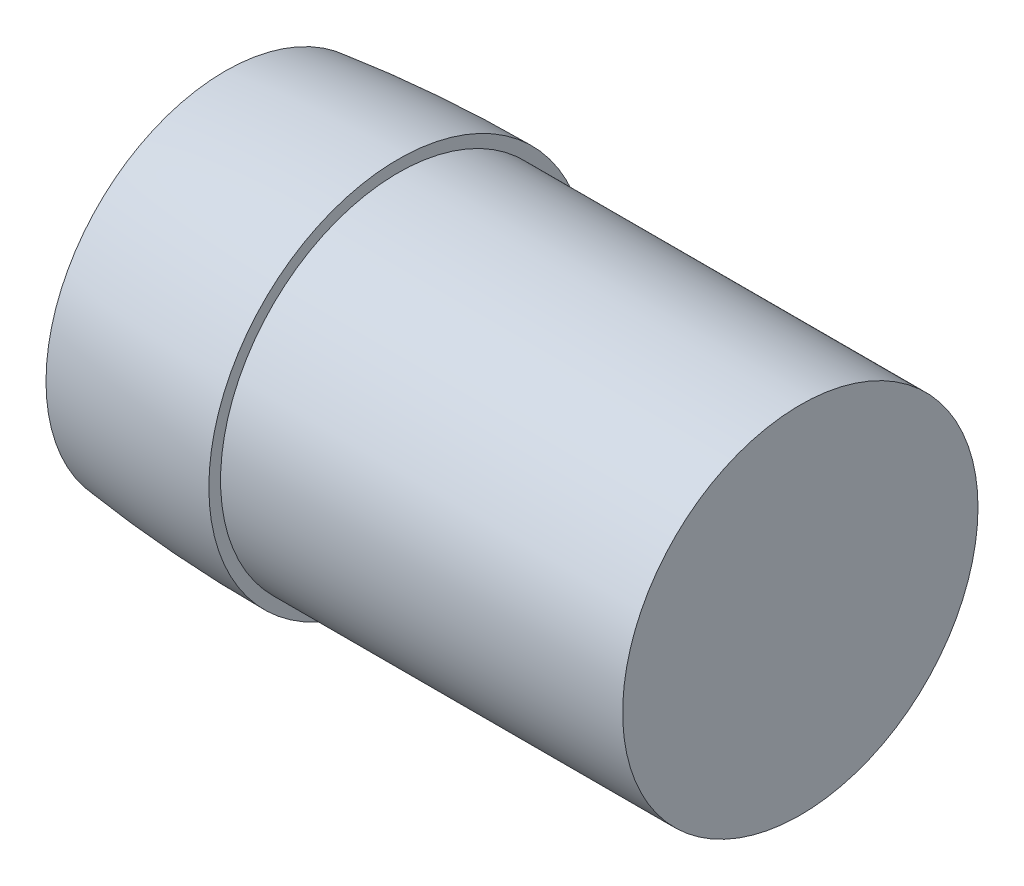
ISO-10303-21;
HEADER;
FILE_DESCRIPTION(('STEP AP214'),'2;1');
FILE_NAME('part.step','',(''),(''),'','','');
FILE_SCHEMA(('AUTOMOTIVE_DESIGN { 1 0 10303 214 1 1 1 1 }'));
ENDSEC;
DATA;
#1=APPLICATION_CONTEXT('core data for automotive mechanical design processes');
#2=APPLICATION_PROTOCOL_DEFINITION('international standard','automotive_design',2000,#1);
#3=PRODUCT_CONTEXT('',#1,'mechanical');
#4=PRODUCT('Part','Part','',(#3));
#5=PRODUCT_RELATED_PRODUCT_CATEGORY('part','',(#4));
#6=PRODUCT_DEFINITION_FORMATION('','',#4);
#7=PRODUCT_DEFINITION_CONTEXT('part definition',#1,'design');
#8=PRODUCT_DEFINITION('design','',#6,#7);
#9=PRODUCT_DEFINITION_SHAPE('','',#8);
#10=(LENGTH_UNIT() NAMED_UNIT(*) SI_UNIT(.MILLI.,.METRE.));
#11=(NAMED_UNIT(*) PLANE_ANGLE_UNIT() SI_UNIT($,.RADIAN.));
#12=(NAMED_UNIT(*) SI_UNIT($,.STERADIAN.) SOLID_ANGLE_UNIT());
#13=UNCERTAINTY_MEASURE_WITH_UNIT(LENGTH_MEASURE(1.E-05),#10,'distance_accuracy_value','');
#14=(GEOMETRIC_REPRESENTATION_CONTEXT(3) GLOBAL_UNCERTAINTY_ASSIGNED_CONTEXT((#13)) GLOBAL_UNIT_ASSIGNED_CONTEXT((#10,
#11,#12)) REPRESENTATION_CONTEXT('',''));
#15=CARTESIAN_POINT('',(0.,0.,0.));
#16=DIRECTION('',(0.,0.,1.));
#17=DIRECTION('',(1.,0.,0.));
#18=AXIS2_PLACEMENT_3D('',#15,#16,#17);
#19=CARTESIAN_POINT('',(-37.,311.98808519809,0.));
#20=DIRECTION('',(1.,0.,0.));
#21=DIRECTION('',(0.,0.,-1.));
#22=AXIS2_PLACEMENT_3D('',#19,#20,#21);
#23=PLANE('',#22);
#24=CARTESIAN_POINT('',(-37.,276.174418604651,0.));
#25=DIRECTION('',(1.,0.,0.));
#26=DIRECTION('',(0.,0.,-1.));
#27=AXIS2_PLACEMENT_3D('',#24,#25,#26);
#28=CIRCLE('',#27,38.3310462104994);
#29=CARTESIAN_POINT('',(-37.,276.174418604651,-38.3310462104994));
#30=VERTEX_POINT('',#29);
#31=EDGE_CURVE('E65',#30,#30,#28,.T.);
#32=ORIENTED_EDGE('',*,*,#31,.F.);
#33=EDGE_LOOP('',(#32));
#34=FACE_BOUND('',#33,.T.);
#35=CARTESIAN_POINT('',(-37.,276.174418604651,0.));
#36=DIRECTION('',(1.,0.,0.));
#37=DIRECTION('',(0.,0.,-1.));
#38=AXIS2_PLACEMENT_3D('',#35,#36,#37);
#39=CIRCLE('',#38,35.8136665934387);
#40=CARTESIAN_POINT('',(-37.,276.174418604651,-35.8136665934387));
#41=VERTEX_POINT('',#40);
#42=EDGE_CURVE('E10',#41,#41,#39,.T.);
#43=ORIENTED_EDGE('',*,*,#42,.T.);
#44=EDGE_LOOP('',(#43));
#45=FACE_BOUND('',#44,.T.);
#46=ADVANCED_FACE('F37',(#34,#45),#23,.F.);
#47=CARTESIAN_POINT('',(0.,276.174418604651,0.));
#48=DIRECTION('',(1.,0.,0.));
#49=DIRECTION('',(0.,0.,-1.));
#50=AXIS2_PLACEMENT_3D('',#47,#48,#49);
#51=DEGENERATE_TOROIDAL_SURFACE('',#50,276.174418604651,314.174418604651,.F.);
#52=ORIENTED_EDGE('',*,*,#42,.F.);
#53=EDGE_LOOP('',(#52));
#54=FACE_BOUND('',#53,.T.);
#55=CARTESIAN_POINT('',(-5.,276.174418604651,0.));
#56=DIRECTION('',(1.,0.,0.));
#57=DIRECTION('',(0.,0.,-1.));
#58=AXIS2_PLACEMENT_3D('',#55,#56,#57);
#59=CIRCLE('',#58,37.9602106637098);
#60=CARTESIAN_POINT('',(-5.,276.174418604651,-37.9602106637098));
#61=VERTEX_POINT('',#60);
#62=EDGE_CURVE('E43',#61,#61,#59,.T.);
#63=ORIENTED_EDGE('',*,*,#62,.T.);
#64=EDGE_LOOP('',(#63));
#65=FACE_BOUND('',#64,.T.);
#66=ADVANCED_FACE('F73',(#54,#65),#51,.T.);
#67=CARTESIAN_POINT('',(-5.,314.134629268361,0.));
#68=DIRECTION('',(-1.,0.,0.));
#69=DIRECTION('',(0.,0.,1.));
#70=AXIS2_PLACEMENT_3D('',#67,#68,#69);
#71=PLANE('',#70);
#72=CARTESIAN_POINT('',(-5.,276.174418604651,0.));
#73=DIRECTION('',(1.,0.,0.));
#74=DIRECTION('',(0.,0.,-1.));
#75=AXIS2_PLACEMENT_3D('',#72,#73,#74);
#76=CIRCLE('',#75,33.);
#77=CARTESIAN_POINT('',(-5.,276.174418604651,-33.));
#78=VERTEX_POINT('',#77);
#79=EDGE_CURVE('E47',#78,#78,#76,.T.);
#80=ORIENTED_EDGE('',*,*,#79,.T.);
#81=EDGE_LOOP('',(#80));
#82=FACE_BOUND('',#81,.T.);
#83=ORIENTED_EDGE('',*,*,#62,.F.);
#84=EDGE_LOOP('',(#83));
#85=FACE_BOUND('',#84,.T.);
#86=ADVANCED_FACE('F77',(#82,#85),#71,.T.);
#87=CARTESIAN_POINT('',(86.,276.174418604651,0.));
#88=DIRECTION('',(1.,0.,0.));
#89=DIRECTION('',(0.,0.,-1.));
#90=AXIS2_PLACEMENT_3D('',#87,#88,#89);
#91=CYLINDRICAL_SURFACE('',#90,33.);
#92=CARTESIAN_POINT('',(81.,276.174418604651,0.));
#93=DIRECTION('',(1.,0.,0.));
#94=DIRECTION('',(0.,0.,-1.));
#95=AXIS2_PLACEMENT_3D('',#92,#93,#94);
#96=CIRCLE('',#95,33.);
#97=CARTESIAN_POINT('',(81.,276.174418604651,-33.));
#98=VERTEX_POINT('',#97);
#99=EDGE_CURVE('E51',#98,#98,#96,.T.);
#100=ORIENTED_EDGE('',*,*,#99,.T.);
#101=EDGE_LOOP('',(#100));
#102=FACE_BOUND('',#101,.T.);
#103=ORIENTED_EDGE('',*,*,#79,.F.);
#104=EDGE_LOOP('',(#103));
#105=FACE_BOUND('',#104,.T.);
#106=ADVANCED_FACE('F82',(#102,#105),#91,.F.);
#107=CARTESIAN_POINT('',(81.,309.174418604651,0.));
#108=DIRECTION('',(-1.,0.,0.));
#109=DIRECTION('',(0.,0.,1.));
#110=AXIS2_PLACEMENT_3D('',#107,#108,#109);
#111=PLANE('',#110);
#112=ORIENTED_EDGE('',*,*,#99,.F.);
#113=EDGE_LOOP('',(#112));
#114=FACE_BOUND('',#113,.T.);
#115=ADVANCED_FACE('F88',(#114),#111,.T.);
#116=CARTESIAN_POINT('',(86.,314.174418604651,0.));
#117=DIRECTION('',(-1.,0.,0.));
#118=DIRECTION('',(0.,0.,1.));
#119=AXIS2_PLACEMENT_3D('',#116,#117,#118);
#120=PLANE('',#119);
#121=CARTESIAN_POINT('',(86.,276.174418604651,0.));
#122=DIRECTION('',(1.,0.,0.));
#123=DIRECTION('',(0.,0.,-1.));
#124=AXIS2_PLACEMENT_3D('',#121,#122,#123);
#125=CIRCLE('',#124,38.);
#126=CARTESIAN_POINT('',(86.,276.174418604651,-38.));
#127=VERTEX_POINT('',#126);
#128=EDGE_CURVE('E56',#127,#127,#125,.T.);
#129=ORIENTED_EDGE('',*,*,#128,.T.);
#130=EDGE_LOOP('',(#129));
#131=FACE_BOUND('',#130,.T.);
#132=ADVANCED_FACE('F92',(#131),#120,.F.);
#133=CARTESIAN_POINT('',(86.,276.174418604651,0.));
#134=DIRECTION('',(1.,0.,0.));
#135=DIRECTION('',(0.,0.,-1.));
#136=AXIS2_PLACEMENT_3D('',#133,#134,#135);
#137=CYLINDRICAL_SURFACE('',#136,38.);
#138=ORIENTED_EDGE('',*,*,#128,.F.);
#139=EDGE_LOOP('',(#138));
#140=FACE_BOUND('',#139,.T.);
#141=CARTESIAN_POINT('',(0.,276.174418604651,0.));
#142=DIRECTION('',(1.,0.,0.));
#143=DIRECTION('',(0.,0.,-1.));
#144=AXIS2_PLACEMENT_3D('',#141,#142,#143);
#145=CIRCLE('',#144,38.);
#146=CARTESIAN_POINT('',(0.,276.174418604651,-38.));
#147=VERTEX_POINT('',#146);
#148=EDGE_CURVE('E59',#147,#147,#145,.T.);
#149=ORIENTED_EDGE('',*,*,#148,.T.);
#150=EDGE_LOOP('',(#149));
#151=FACE_BOUND('',#150,.T.);
#152=ADVANCED_FACE('F96',(#140,#151),#137,.T.);
#153=CARTESIAN_POINT('',(0.,316.674418604651,0.));
#154=DIRECTION('',(-1.,0.,0.));
#155=DIRECTION('',(0.,0.,1.));
#156=AXIS2_PLACEMENT_3D('',#153,#154,#155);
#157=PLANE('',#156);
#158=ORIENTED_EDGE('',*,*,#148,.F.);
#159=EDGE_LOOP('',(#158));
#160=FACE_BOUND('',#159,.T.);
#161=CARTESIAN_POINT('',(0.,276.174418604651,0.));
#162=DIRECTION('',(1.,0.,0.));
#163=DIRECTION('',(0.,0.,-1.));
#164=AXIS2_PLACEMENT_3D('',#161,#162,#163);
#165=CIRCLE('',#164,40.5000000000001);
#166=CARTESIAN_POINT('',(0.,276.174418604651,-40.5000000000001));
#167=VERTEX_POINT('',#166);
#168=EDGE_CURVE('E62',#167,#167,#165,.T.);
#169=ORIENTED_EDGE('',*,*,#168,.T.);
#170=EDGE_LOOP('',(#169));
#171=FACE_BOUND('',#170,.T.);
#172=ADVANCED_FACE('F100',(#160,#171),#157,.F.);
#173=CARTESIAN_POINT('',(0.,276.174418604651,0.));
#174=DIRECTION('',(1.,0.,0.));
#175=DIRECTION('',(0.,0.,-1.));
#176=AXIS2_PLACEMENT_3D('',#173,#174,#175);
#177=DEGENERATE_TOROIDAL_SURFACE('',#176,276.174418604651,316.674418604651,.F.);
#178=ORIENTED_EDGE('',*,*,#31,.T.);
#179=EDGE_LOOP('',(#178));
#180=FACE_BOUND('',#179,.T.);
#181=ORIENTED_EDGE('',*,*,#168,.F.);
#182=EDGE_LOOP('',(#181));
#183=FACE_BOUND('',#182,.T.);
#184=ADVANCED_FACE('F69',(#180,#183),#177,.F.);
#185=CLOSED_SHELL('',(#46,#66,#86,#106,#115,#132,#152,#172,#184));
#186=MANIFOLD_SOLID_BREP('B2',#185);
#187=ADVANCED_BREP_SHAPE_REPRESENTATION('',(#18,#186),#14);
#188=SHAPE_DEFINITION_REPRESENTATION(#9,#187);
ENDSEC;
END-ISO-10303-21;
